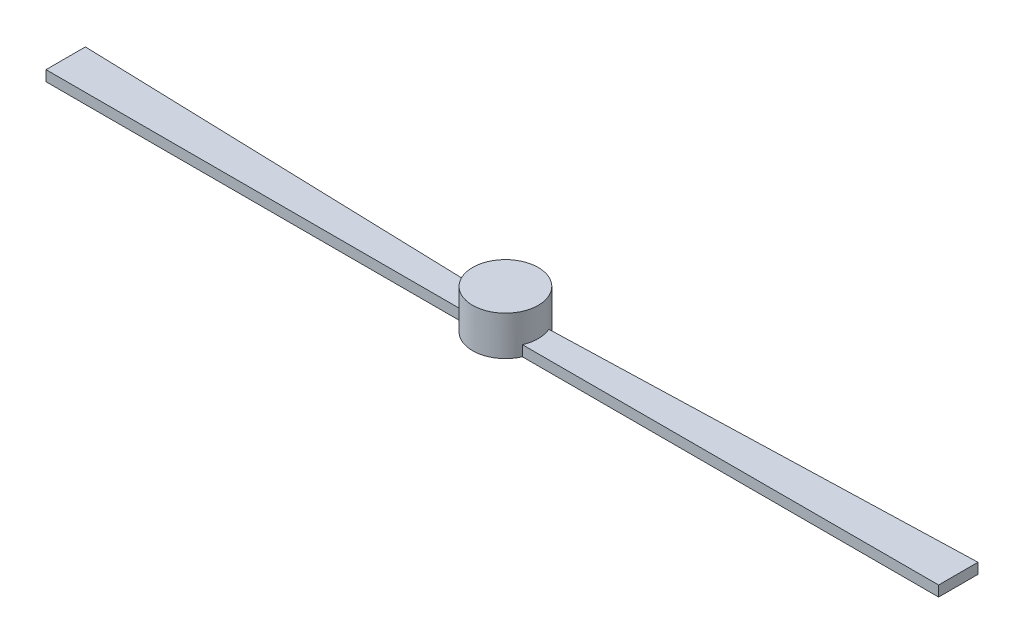
ISO-10303-21;
HEADER;
FILE_DESCRIPTION(('STEP AP214'),'2;1');
FILE_NAME('part.step','',(''),(''),'','','');
FILE_SCHEMA(('AUTOMOTIVE_DESIGN { 1 0 10303 214 1 1 1 1 }'));
ENDSEC;
DATA;
#1=APPLICATION_CONTEXT('core data for automotive mechanical design processes');
#2=APPLICATION_PROTOCOL_DEFINITION('international standard','automotive_design',2000,#1);
#3=PRODUCT_CONTEXT('',#1,'mechanical');
#4=PRODUCT('Part','Part','',(#3));
#5=PRODUCT_RELATED_PRODUCT_CATEGORY('part','',(#4));
#6=PRODUCT_DEFINITION_FORMATION('','',#4);
#7=PRODUCT_DEFINITION_CONTEXT('part definition',#1,'design');
#8=PRODUCT_DEFINITION('design','',#6,#7);
#9=PRODUCT_DEFINITION_SHAPE('','',#8);
#10=(LENGTH_UNIT() NAMED_UNIT(*) SI_UNIT(.MILLI.,.METRE.));
#11=(NAMED_UNIT(*) PLANE_ANGLE_UNIT() SI_UNIT($,.RADIAN.));
#12=(NAMED_UNIT(*) SI_UNIT($,.STERADIAN.) SOLID_ANGLE_UNIT());
#13=UNCERTAINTY_MEASURE_WITH_UNIT(LENGTH_MEASURE(1.E-05),#10,'distance_accuracy_value','');
#14=(GEOMETRIC_REPRESENTATION_CONTEXT(3) GLOBAL_UNCERTAINTY_ASSIGNED_CONTEXT((#13)) GLOBAL_UNIT_ASSIGNED_CONTEXT((#10,
#11,#12)) REPRESENTATION_CONTEXT('',''));
#15=CARTESIAN_POINT('',(0.,0.,0.));
#16=DIRECTION('',(0.,0.,1.));
#17=DIRECTION('',(1.,0.,0.));
#18=AXIS2_PLACEMENT_3D('',#15,#16,#17);
#19=CARTESIAN_POINT('',(0.,30.,0.));
#20=DIRECTION('',(0.,-1.,0.));
#21=DIRECTION('',(0.,0.,-1.));
#22=AXIS2_PLACEMENT_3D('',#19,#20,#21);
#23=CYLINDRICAL_SURFACE('',#22,25.);
#24=CARTESIAN_POINT('',(0.,30.,0.));
#25=DIRECTION('',(0.,1.,0.));
#26=DIRECTION('',(0.,0.,1.));
#27=AXIS2_PLACEMENT_3D('',#24,#25,#26);
#28=CIRCLE('',#27,25.);
#29=CARTESIAN_POINT('',(0.,30.,25.));
#30=VERTEX_POINT('',#29);
#31=EDGE_CURVE('E159',#30,#30,#28,.T.);
#32=ORIENTED_EDGE('',*,*,#31,.F.);
#33=EDGE_LOOP('',(#32));
#34=FACE_BOUND('',#33,.T.);
#35=DIRECTION('',(0.,-1.,0.));
#36=VECTOR('',#35,1.);
#37=CARTESIAN_POINT('',(22.9128784747792,30.,10.));
#38=LINE('',#37,#36);
#39=CARTESIAN_POINT('',(22.9128784747792,8.,10.));
#40=VERTEX_POINT('',#39);
#41=CARTESIAN_POINT('',(22.9128784747792,0.,10.));
#42=VERTEX_POINT('',#41);
#43=EDGE_CURVE('E157',#40,#42,#38,.T.);
#44=ORIENTED_EDGE('',*,*,#43,.F.);
#45=CARTESIAN_POINT('',(0.,8.,0.));
#46=DIRECTION('',(0.,1.,0.));
#47=DIRECTION('',(0.,0.,1.));
#48=AXIS2_PLACEMENT_3D('',#45,#46,#47);
#49=CIRCLE('',#48,25.);
#50=CARTESIAN_POINT('',(22.8065402591028,8.,-10.2402012387416));
#51=VERTEX_POINT('',#50);
#52=EDGE_CURVE('E11',#40,#51,#49,.T.);
#53=ORIENTED_EDGE('',*,*,#52,.T.);
#54=DIRECTION('',(0.,-1.,0.));
#55=VECTOR('',#54,1.);
#56=CARTESIAN_POINT('',(22.8065402591028,30.,-10.2402012387416));
#57=LINE('',#56,#55);
#58=CARTESIAN_POINT('',(22.8065402591028,0.,-10.2402012387416));
#59=VERTEX_POINT('',#58);
#60=EDGE_CURVE('E154',#59,#51,#57,.F.);
#61=ORIENTED_EDGE('',*,*,#60,.F.);
#62=CARTESIAN_POINT('',(0.,0.,0.));
#63=DIRECTION('',(0.,1.,0.));
#64=DIRECTION('',(0.,0.,1.));
#65=AXIS2_PLACEMENT_3D('',#62,#63,#64);
#66=CIRCLE('',#65,25.);
#67=CARTESIAN_POINT('',(-22.8065402591028,0.,-10.2402012387416));
#68=VERTEX_POINT('',#67);
#69=EDGE_CURVE('E165',#59,#68,#66,.T.);
#70=ORIENTED_EDGE('',*,*,#69,.T.);
#71=DIRECTION('',(0.,-1.,0.));
#72=VECTOR('',#71,1.);
#73=CARTESIAN_POINT('',(-22.8065402591028,30.,-10.2402012387416));
#74=LINE('',#73,#72);
#75=CARTESIAN_POINT('',(-22.8065402591028,8.,-10.2402012387416));
#76=VERTEX_POINT('',#75);
#77=EDGE_CURVE('E152',#76,#68,#74,.T.);
#78=ORIENTED_EDGE('',*,*,#77,.F.);
#79=CARTESIAN_POINT('',(0.,8.,0.));
#80=DIRECTION('',(0.,-1.,0.));
#81=DIRECTION('',(0.,0.,-1.));
#82=AXIS2_PLACEMENT_3D('',#79,#80,#81);
#83=CIRCLE('',#82,25.);
#84=CARTESIAN_POINT('',(-22.9128784747792,8.,10.));
#85=VERTEX_POINT('',#84);
#86=EDGE_CURVE('E46',#85,#76,#83,.T.);
#87=ORIENTED_EDGE('',*,*,#86,.F.);
#88=DIRECTION('',(0.,-1.,0.));
#89=VECTOR('',#88,1.);
#90=CARTESIAN_POINT('',(-22.9128784747792,30.,10.));
#91=LINE('',#90,#89);
#92=CARTESIAN_POINT('',(-22.9128784747792,0.,10.));
#93=VERTEX_POINT('',#92);
#94=EDGE_CURVE('E120',#93,#85,#91,.F.);
#95=ORIENTED_EDGE('',*,*,#94,.F.);
#96=EDGE_CURVE('E156',#93,#42,#66,.T.);
#97=ORIENTED_EDGE('',*,*,#96,.T.);
#98=EDGE_LOOP('',(#44,#53,#61,#70,#78,#87,#95,#97));
#99=FACE_BOUND('',#98,.T.);
#100=ADVANCED_FACE('F39',(#34,#99),#23,.T.);
#101=CARTESIAN_POINT('',(0.,30.,0.));
#102=DIRECTION('',(0.,1.,0.));
#103=DIRECTION('',(0.,0.,1.));
#104=AXIS2_PLACEMENT_3D('',#101,#102,#103);
#105=PLANE('',#104);
#106=ORIENTED_EDGE('',*,*,#31,.T.);
#107=EDGE_LOOP('',(#106));
#108=FACE_BOUND('',#107,.T.);
#109=ADVANCED_FACE('F198',(#108),#105,.T.);
#110=CARTESIAN_POINT('',(0.,0.,0.));
#111=DIRECTION('',(0.,1.,0.));
#112=DIRECTION('',(0.,0.,1.));
#113=AXIS2_PLACEMENT_3D('',#110,#111,#112);
#114=PLANE('',#113);
#115=ORIENTED_EDGE('',*,*,#69,.F.);
#116=DIRECTION('',(-0.999526963076654,0.,0.030754675786974));
#117=VECTOR('',#116,1.);
#118=CARTESIAN_POINT('',(15.,0.,-10.));
#119=LINE('',#118,#117);
#120=CARTESIAN_POINT('',(340.,0.,-20.));
#121=VERTEX_POINT('',#120);
#122=EDGE_CURVE('E108',#121,#59,#119,.T.);
#123=ORIENTED_EDGE('',*,*,#122,.F.);
#124=DIRECTION('',(0.,0.,-1.));
#125=VECTOR('',#124,1.);
#126=CARTESIAN_POINT('',(340.,0.,-20.));
#127=LINE('',#126,#125);
#128=CARTESIAN_POINT('',(340.,0.,10.));
#129=VERTEX_POINT('',#128);
#130=EDGE_CURVE('E128',#129,#121,#127,.T.);
#131=ORIENTED_EDGE('',*,*,#130,.F.);
#132=DIRECTION('',(1.,0.,0.));
#133=VECTOR('',#132,1.);
#134=CARTESIAN_POINT('',(340.,0.,10.));
#135=LINE('',#134,#133);
#136=EDGE_CURVE('E114',#42,#129,#135,.T.);
#137=ORIENTED_EDGE('',*,*,#136,.F.);
#138=ORIENTED_EDGE('',*,*,#96,.F.);
#139=DIRECTION('',(1.,0.,0.));
#140=VECTOR('',#139,1.);
#141=CARTESIAN_POINT('',(-340.,0.,10.));
#142=LINE('',#141,#140);
#143=CARTESIAN_POINT('',(-340.,0.,10.));
#144=VERTEX_POINT('',#143);
#145=EDGE_CURVE('E138',#144,#93,#142,.T.);
#146=ORIENTED_EDGE('',*,*,#145,.F.);
#147=DIRECTION('',(0.,0.,1.));
#148=VECTOR('',#147,1.);
#149=CARTESIAN_POINT('',(-340.,0.,-20.));
#150=LINE('',#149,#148);
#151=CARTESIAN_POINT('',(-340.,0.,-20.));
#152=VERTEX_POINT('',#151);
#153=EDGE_CURVE('E141',#152,#144,#150,.T.);
#154=ORIENTED_EDGE('',*,*,#153,.F.);
#155=DIRECTION('',(-0.999526963076654,0.,-0.030754675786974));
#156=VECTOR('',#155,1.);
#157=CARTESIAN_POINT('',(-15.,0.,-10.));
#158=LINE('',#157,#156);
#159=EDGE_CURVE('E130',#68,#152,#158,.T.);
#160=ORIENTED_EDGE('',*,*,#159,.F.);
#161=EDGE_LOOP('',(#115,#123,#131,#137,#138,#146,#154,#160));
#162=FACE_BOUND('',#161,.T.);
#163=ADVANCED_FACE('F183',(#162),#114,.F.);
#164=CARTESIAN_POINT('',(-15.,8.,-10.));
#165=DIRECTION('',(-0.030754675786974,0.,0.999526963076654));
#166=DIRECTION('',(0.999526963076654,0.,0.030754675786974));
#167=AXIS2_PLACEMENT_3D('',#164,#165,#166);
#168=PLANE('',#167);
#169=DIRECTION('',(-0.999526963076654,0.,-0.030754675786974));
#170=VECTOR('',#169,1.);
#171=CARTESIAN_POINT('',(-15.,8.,-10.));
#172=LINE('',#171,#170);
#173=CARTESIAN_POINT('',(-340.,8.,-20.));
#174=VERTEX_POINT('',#173);
#175=EDGE_CURVE('E145',#76,#174,#172,.T.);
#176=ORIENTED_EDGE('',*,*,#175,.F.);
#177=ORIENTED_EDGE('',*,*,#77,.T.);
#178=ORIENTED_EDGE('',*,*,#159,.T.);
#179=DIRECTION('',(0.,-1.,0.));
#180=VECTOR('',#179,1.);
#181=CARTESIAN_POINT('',(-340.,8.,-20.));
#182=LINE('',#181,#180);
#183=EDGE_CURVE('E131',#174,#152,#182,.T.);
#184=ORIENTED_EDGE('',*,*,#183,.F.);
#185=EDGE_LOOP('',(#176,#177,#178,#184));
#186=FACE_BOUND('',#185,.T.);
#187=ADVANCED_FACE('F169',(#186),#168,.F.);
#188=CARTESIAN_POINT('',(-340.,8.,10.));
#189=DIRECTION('',(0.,0.,-1.));
#190=DIRECTION('',(-1.,0.,0.));
#191=AXIS2_PLACEMENT_3D('',#188,#189,#190);
#192=PLANE('',#191);
#193=ORIENTED_EDGE('',*,*,#145,.T.);
#194=ORIENTED_EDGE('',*,*,#94,.T.);
#195=DIRECTION('',(1.,0.,0.));
#196=VECTOR('',#195,1.);
#197=CARTESIAN_POINT('',(-340.,8.,10.));
#198=LINE('',#197,#196);
#199=CARTESIAN_POINT('',(-340.,8.,10.));
#200=VERTEX_POINT('',#199);
#201=EDGE_CURVE('E140',#200,#85,#198,.T.);
#202=ORIENTED_EDGE('',*,*,#201,.F.);
#203=DIRECTION('',(0.,-1.,0.));
#204=VECTOR('',#203,1.);
#205=CARTESIAN_POINT('',(-340.,8.,10.));
#206=LINE('',#205,#204);
#207=EDGE_CURVE('E132',#200,#144,#206,.T.);
#208=ORIENTED_EDGE('',*,*,#207,.T.);
#209=EDGE_LOOP('',(#193,#194,#202,#208));
#210=FACE_BOUND('',#209,.T.);
#211=ADVANCED_FACE('F177',(#210),#192,.F.);
#212=CARTESIAN_POINT('',(-340.,8.,-20.));
#213=DIRECTION('',(1.,0.,0.));
#214=DIRECTION('',(0.,0.,-1.));
#215=AXIS2_PLACEMENT_3D('',#212,#213,#214);
#216=PLANE('',#215);
#217=ORIENTED_EDGE('',*,*,#153,.T.);
#218=ORIENTED_EDGE('',*,*,#207,.F.);
#219=DIRECTION('',(0.,0.,1.));
#220=VECTOR('',#219,1.);
#221=CARTESIAN_POINT('',(-340.,8.,-20.));
#222=LINE('',#221,#220);
#223=EDGE_CURVE('E150',#174,#200,#222,.T.);
#224=ORIENTED_EDGE('',*,*,#223,.F.);
#225=ORIENTED_EDGE('',*,*,#183,.T.);
#226=EDGE_LOOP('',(#217,#218,#224,#225));
#227=FACE_BOUND('',#226,.T.);
#228=ADVANCED_FACE('F176',(#227),#216,.F.);
#229=CARTESIAN_POINT('',(0.,8.,0.));
#230=DIRECTION('',(0.,-1.,0.));
#231=DIRECTION('',(0.,0.,-1.));
#232=AXIS2_PLACEMENT_3D('',#229,#230,#231);
#233=PLANE('',#232);
#234=ORIENTED_EDGE('',*,*,#201,.T.);
#235=ORIENTED_EDGE('',*,*,#86,.T.);
#236=ORIENTED_EDGE('',*,*,#175,.T.);
#237=ORIENTED_EDGE('',*,*,#223,.T.);
#238=EDGE_LOOP('',(#234,#235,#236,#237));
#239=FACE_BOUND('',#238,.T.);
#240=ADVANCED_FACE('F168',(#239),#233,.F.);
#241=CARTESIAN_POINT('',(340.,8.,10.));
#242=DIRECTION('',(0.,0.,-1.));
#243=DIRECTION('',(-1.,0.,0.));
#244=AXIS2_PLACEMENT_3D('',#241,#242,#243);
#245=PLANE('',#244);
#246=DIRECTION('',(1.,0.,0.));
#247=VECTOR('',#246,1.);
#248=CARTESIAN_POINT('',(340.,8.,10.));
#249=LINE('',#248,#247);
#250=CARTESIAN_POINT('',(340.,8.,10.));
#251=VERTEX_POINT('',#250);
#252=EDGE_CURVE('E99',#40,#251,#249,.T.);
#253=ORIENTED_EDGE('',*,*,#252,.F.);
#254=ORIENTED_EDGE('',*,*,#43,.T.);
#255=ORIENTED_EDGE('',*,*,#136,.T.);
#256=DIRECTION('',(0.,-1.,0.));
#257=VECTOR('',#256,1.);
#258=CARTESIAN_POINT('',(340.,8.,10.));
#259=LINE('',#258,#257);
#260=EDGE_CURVE('E112',#251,#129,#259,.T.);
#261=ORIENTED_EDGE('',*,*,#260,.F.);
#262=EDGE_LOOP('',(#253,#254,#255,#261));
#263=FACE_BOUND('',#262,.T.);
#264=ADVANCED_FACE('F115',(#263),#245,.F.);
#265=CARTESIAN_POINT('',(15.,8.,-10.));
#266=DIRECTION('',(0.030754675786974,0.,0.999526963076654));
#267=DIRECTION('',(0.999526963076654,0.,-0.030754675786974));
#268=AXIS2_PLACEMENT_3D('',#265,#266,#267);
#269=PLANE('',#268);
#270=ORIENTED_EDGE('',*,*,#122,.T.);
#271=ORIENTED_EDGE('',*,*,#60,.T.);
#272=DIRECTION('',(-0.999526963076654,0.,0.030754675786974));
#273=VECTOR('',#272,1.);
#274=CARTESIAN_POINT('',(15.,8.,-10.));
#275=LINE('',#274,#273);
#276=CARTESIAN_POINT('',(340.,8.,-20.));
#277=VERTEX_POINT('',#276);
#278=EDGE_CURVE('E52',#277,#51,#275,.T.);
#279=ORIENTED_EDGE('',*,*,#278,.F.);
#280=DIRECTION('',(0.,-1.,0.));
#281=VECTOR('',#280,1.);
#282=CARTESIAN_POINT('',(340.,8.,-20.));
#283=LINE('',#282,#281);
#284=EDGE_CURVE('E118',#277,#121,#283,.T.);
#285=ORIENTED_EDGE('',*,*,#284,.T.);
#286=EDGE_LOOP('',(#270,#271,#279,#285));
#287=FACE_BOUND('',#286,.T.);
#288=ADVANCED_FACE('F186',(#287),#269,.F.);
#289=CARTESIAN_POINT('',(340.,8.,-20.));
#290=DIRECTION('',(-1.,0.,0.));
#291=DIRECTION('',(0.,0.,1.));
#292=AXIS2_PLACEMENT_3D('',#289,#290,#291);
#293=PLANE('',#292);
#294=ORIENTED_EDGE('',*,*,#130,.T.);
#295=ORIENTED_EDGE('',*,*,#284,.F.);
#296=DIRECTION('',(0.,0.,-1.));
#297=VECTOR('',#296,1.);
#298=CARTESIAN_POINT('',(340.,8.,-20.));
#299=LINE('',#298,#297);
#300=EDGE_CURVE('E101',#251,#277,#299,.T.);
#301=ORIENTED_EDGE('',*,*,#300,.F.);
#302=ORIENTED_EDGE('',*,*,#260,.T.);
#303=EDGE_LOOP('',(#294,#295,#301,#302));
#304=FACE_BOUND('',#303,.T.);
#305=ADVANCED_FACE('F116',(#304),#293,.F.);
#306=CARTESIAN_POINT('',(0.,8.,0.));
#307=DIRECTION('',(0.,1.,0.));
#308=DIRECTION('',(0.,0.,1.));
#309=AXIS2_PLACEMENT_3D('',#306,#307,#308);
#310=PLANE('',#309);
#311=ORIENTED_EDGE('',*,*,#52,.F.);
#312=ORIENTED_EDGE('',*,*,#252,.T.);
#313=ORIENTED_EDGE('',*,*,#300,.T.);
#314=ORIENTED_EDGE('',*,*,#278,.T.);
#315=EDGE_LOOP('',(#311,#312,#313,#314));
#316=FACE_BOUND('',#315,.T.);
#317=ADVANCED_FACE('F105',(#316),#310,.T.);
#318=CLOSED_SHELL('',(#100,#109,#163,#187,#211,#228,#240,#264,#288,#305,#317));
#319=MANIFOLD_SOLID_BREP('B2',#318);
#320=ADVANCED_BREP_SHAPE_REPRESENTATION('',(#18,#319),#14);
#321=SHAPE_DEFINITION_REPRESENTATION(#9,#320);
ENDSEC;
END-ISO-10303-21;
